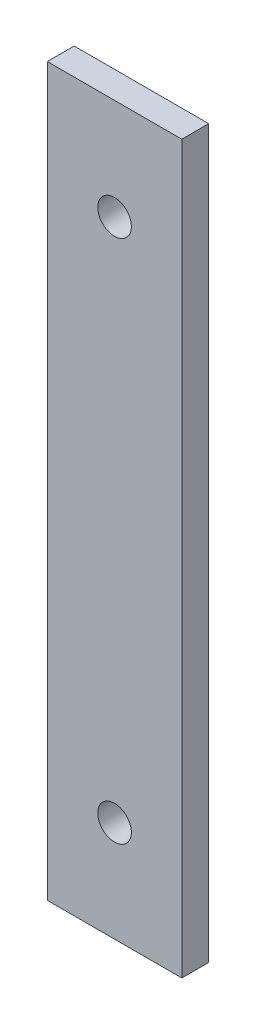
ISO-10303-21;
HEADER;
FILE_DESCRIPTION(('STEP AP214'),'2;1');
FILE_NAME('part.step','',(''),(''),'','','');
FILE_SCHEMA(('AUTOMOTIVE_DESIGN { 1 0 10303 214 1 1 1 1 }'));
ENDSEC;
DATA;
#1=APPLICATION_CONTEXT('core data for automotive mechanical design processes');
#2=APPLICATION_PROTOCOL_DEFINITION('international standard','automotive_design',2000,#1);
#3=PRODUCT_CONTEXT('',#1,'mechanical');
#4=PRODUCT('Part','Part','',(#3));
#5=PRODUCT_RELATED_PRODUCT_CATEGORY('part','',(#4));
#6=PRODUCT_DEFINITION_FORMATION('','',#4);
#7=PRODUCT_DEFINITION_CONTEXT('part definition',#1,'design');
#8=PRODUCT_DEFINITION('design','',#6,#7);
#9=PRODUCT_DEFINITION_SHAPE('','',#8);
#10=(LENGTH_UNIT() NAMED_UNIT(*) SI_UNIT(.MILLI.,.METRE.));
#11=(NAMED_UNIT(*) PLANE_ANGLE_UNIT() SI_UNIT($,.RADIAN.));
#12=(NAMED_UNIT(*) SI_UNIT($,.STERADIAN.) SOLID_ANGLE_UNIT());
#13=UNCERTAINTY_MEASURE_WITH_UNIT(LENGTH_MEASURE(1.E-05),#10,'distance_accuracy_value','');
#14=(GEOMETRIC_REPRESENTATION_CONTEXT(3) GLOBAL_UNCERTAINTY_ASSIGNED_CONTEXT((#13)) GLOBAL_UNIT_ASSIGNED_CONTEXT((#10,
#11,#12)) REPRESENTATION_CONTEXT('',''));
#15=CARTESIAN_POINT('',(0.,0.,0.));
#16=DIRECTION('',(0.,0.,1.));
#17=DIRECTION('',(1.,0.,0.));
#18=AXIS2_PLACEMENT_3D('',#15,#16,#17);
#19=CARTESIAN_POINT('',(0.,0.,2.));
#20=DIRECTION('',(0.,0.,1.));
#21=DIRECTION('',(1.,0.,0.));
#22=AXIS2_PLACEMENT_3D('',#19,#20,#21);
#23=PLANE('',#22);
#24=CARTESIAN_POINT('',(-1.72898253873052,6.36597938144332,2.));
#25=DIRECTION('',(0.,0.,1.));
#26=DIRECTION('',(1.,0.,0.));
#27=AXIS2_PLACEMENT_3D('',#24,#25,#26);
#28=CIRCLE('',#27,1.25);
#29=CARTESIAN_POINT('',(-0.478982538730516,6.36597938144332,2.));
#30=VERTEX_POINT('',#29);
#31=EDGE_CURVE('E100',#30,#30,#28,.T.);
#32=ORIENTED_EDGE('',*,*,#31,.F.);
#33=EDGE_LOOP('',(#32));
#34=FACE_BOUND('',#33,.T.);
#35=DIRECTION('',(0.,-1.,0.));
#36=VECTOR('',#35,1.);
#37=CARTESIAN_POINT('',(-6.72898253873052,13.8659793814433,2.));
#38=LINE('',#37,#36);
#39=CARTESIAN_POINT('',(-6.72898253873052,13.8659793814433,2.));
#40=VERTEX_POINT('',#39);
#41=CARTESIAN_POINT('',(-6.72898253873051,-40.1340206185567,2.));
#42=VERTEX_POINT('',#41);
#43=EDGE_CURVE('E85',#40,#42,#38,.T.);
#44=ORIENTED_EDGE('',*,*,#43,.T.);
#45=DIRECTION('',(1.,0.,0.));
#46=VECTOR('',#45,1.);
#47=CARTESIAN_POINT('',(-6.72898253873051,-40.1340206185567,2.));
#48=LINE('',#47,#46);
#49=CARTESIAN_POINT('',(3.27101746126949,-40.1340206185567,2.));
#50=VERTEX_POINT('',#49);
#51=EDGE_CURVE('E80',#42,#50,#48,.T.);
#52=ORIENTED_EDGE('',*,*,#51,.T.);
#53=DIRECTION('',(0.,1.,0.));
#54=VECTOR('',#53,1.);
#55=CARTESIAN_POINT('',(3.27101746126948,13.8659793814433,2.));
#56=LINE('',#55,#54);
#57=CARTESIAN_POINT('',(3.27101746126948,13.8659793814433,2.));
#58=VERTEX_POINT('',#57);
#59=EDGE_CURVE('E83',#50,#58,#56,.T.);
#60=ORIENTED_EDGE('',*,*,#59,.T.);
#61=DIRECTION('',(-1.,0.,0.));
#62=VECTOR('',#61,1.);
#63=CARTESIAN_POINT('',(-6.72898253873052,13.8659793814433,2.));
#64=LINE('',#63,#62);
#65=EDGE_CURVE('E50',#58,#40,#64,.T.);
#66=ORIENTED_EDGE('',*,*,#65,.T.);
#67=EDGE_LOOP('',(#44,#52,#60,#66));
#68=FACE_BOUND('',#67,.T.);
#69=CARTESIAN_POINT('',(-1.72898253873052,-32.6340206185567,2.));
#70=DIRECTION('',(0.,0.,1.));
#71=DIRECTION('',(1.,0.,0.));
#72=AXIS2_PLACEMENT_3D('',#69,#70,#71);
#73=CIRCLE('',#72,1.25);
#74=CARTESIAN_POINT('',(-0.478982538730515,-32.6340206185567,2.));
#75=VERTEX_POINT('',#74);
#76=EDGE_CURVE('E115',#75,#75,#73,.T.);
#77=ORIENTED_EDGE('',*,*,#76,.F.);
#78=EDGE_LOOP('',(#77));
#79=FACE_BOUND('',#78,.T.);
#80=ADVANCED_FACE('F33',(#34,#68,#79),#23,.T.);
#81=CARTESIAN_POINT('',(0.,0.,0.));
#82=DIRECTION('',(0.,0.,1.));
#83=DIRECTION('',(1.,0.,0.));
#84=AXIS2_PLACEMENT_3D('',#81,#82,#83);
#85=PLANE('',#84);
#86=DIRECTION('',(0.,-1.,0.));
#87=VECTOR('',#86,1.);
#88=CARTESIAN_POINT('',(-6.72898253873052,13.8659793814433,0.));
#89=LINE('',#88,#87);
#90=CARTESIAN_POINT('',(-6.72898253873052,13.8659793814433,0.));
#91=VERTEX_POINT('',#90);
#92=CARTESIAN_POINT('',(-6.72898253873051,-40.1340206185567,0.));
#93=VERTEX_POINT('',#92);
#94=EDGE_CURVE('E97',#91,#93,#89,.T.);
#95=ORIENTED_EDGE('',*,*,#94,.F.);
#96=DIRECTION('',(-1.,0.,0.));
#97=VECTOR('',#96,1.);
#98=CARTESIAN_POINT('',(-6.72898253873052,13.8659793814433,0.));
#99=LINE('',#98,#97);
#100=CARTESIAN_POINT('',(3.27101746126948,13.8659793814433,0.));
#101=VERTEX_POINT('',#100);
#102=EDGE_CURVE('E73',#101,#91,#99,.T.);
#103=ORIENTED_EDGE('',*,*,#102,.F.);
#104=DIRECTION('',(0.,1.,0.));
#105=VECTOR('',#104,1.);
#106=CARTESIAN_POINT('',(3.27101746126948,13.8659793814433,0.));
#107=LINE('',#106,#105);
#108=CARTESIAN_POINT('',(3.27101746126949,-40.1340206185567,0.));
#109=VERTEX_POINT('',#108);
#110=EDGE_CURVE('E67',#109,#101,#107,.T.);
#111=ORIENTED_EDGE('',*,*,#110,.F.);
#112=DIRECTION('',(1.,0.,0.));
#113=VECTOR('',#112,1.);
#114=CARTESIAN_POINT('',(-6.72898253873051,-40.1340206185567,0.));
#115=LINE('',#114,#113);
#116=EDGE_CURVE('E89',#93,#109,#115,.T.);
#117=ORIENTED_EDGE('',*,*,#116,.F.);
#118=EDGE_LOOP('',(#95,#103,#111,#117));
#119=FACE_BOUND('',#118,.T.);
#120=CARTESIAN_POINT('',(-1.72898253873052,6.36597938144332,0.));
#121=DIRECTION('',(0.,0.,1.));
#122=DIRECTION('',(1.,0.,0.));
#123=AXIS2_PLACEMENT_3D('',#120,#121,#122);
#124=CIRCLE('',#123,1.25);
#125=CARTESIAN_POINT('',(-0.478982538730516,6.36597938144332,0.));
#126=VERTEX_POINT('',#125);
#127=EDGE_CURVE('E112',#126,#126,#124,.T.);
#128=ORIENTED_EDGE('',*,*,#127,.T.);
#129=EDGE_LOOP('',(#128));
#130=FACE_BOUND('',#129,.T.);
#131=CARTESIAN_POINT('',(-1.72898253873052,-32.6340206185567,0.));
#132=DIRECTION('',(0.,0.,1.));
#133=DIRECTION('',(1.,0.,0.));
#134=AXIS2_PLACEMENT_3D('',#131,#132,#133);
#135=CIRCLE('',#134,1.25);
#136=CARTESIAN_POINT('',(-0.478982538730515,-32.6340206185567,0.));
#137=VERTEX_POINT('',#136);
#138=EDGE_CURVE('E118',#137,#137,#135,.T.);
#139=ORIENTED_EDGE('',*,*,#138,.T.);
#140=EDGE_LOOP('',(#139));
#141=FACE_BOUND('',#140,.T.);
#142=ADVANCED_FACE('F108',(#119,#130,#141),#85,.F.);
#143=CARTESIAN_POINT('',(-6.72898253873052,13.8659793814433,2.));
#144=DIRECTION('',(1.,0.,0.));
#145=DIRECTION('',(0.,1.,0.));
#146=AXIS2_PLACEMENT_3D('',#143,#144,#145);
#147=PLANE('',#146);
#148=ORIENTED_EDGE('',*,*,#94,.T.);
#149=DIRECTION('',(0.,0.,-1.));
#150=VECTOR('',#149,1.);
#151=CARTESIAN_POINT('',(-6.72898253873051,-40.1340206185567,2.));
#152=LINE('',#151,#150);
#153=EDGE_CURVE('E11',#42,#93,#152,.T.);
#154=ORIENTED_EDGE('',*,*,#153,.F.);
#155=ORIENTED_EDGE('',*,*,#43,.F.);
#156=DIRECTION('',(0.,0.,-1.));
#157=VECTOR('',#156,1.);
#158=CARTESIAN_POINT('',(-6.72898253873052,13.8659793814433,2.));
#159=LINE('',#158,#157);
#160=EDGE_CURVE('E93',#40,#91,#159,.T.);
#161=ORIENTED_EDGE('',*,*,#160,.T.);
#162=EDGE_LOOP('',(#148,#154,#155,#161));
#163=FACE_BOUND('',#162,.T.);
#164=ADVANCED_FACE('F35',(#163),#147,.F.);
#165=CARTESIAN_POINT('',(-6.72898253873051,-40.1340206185567,2.));
#166=DIRECTION('',(0.,1.,0.));
#167=DIRECTION('',(0.,0.,1.));
#168=AXIS2_PLACEMENT_3D('',#165,#166,#167);
#169=PLANE('',#168);
#170=ORIENTED_EDGE('',*,*,#116,.T.);
#171=DIRECTION('',(0.,0.,-1.));
#172=VECTOR('',#171,1.);
#173=CARTESIAN_POINT('',(3.27101746126949,-40.1340206185567,2.));
#174=LINE('',#173,#172);
#175=EDGE_CURVE('E42',#50,#109,#174,.T.);
#176=ORIENTED_EDGE('',*,*,#175,.F.);
#177=ORIENTED_EDGE('',*,*,#51,.F.);
#178=ORIENTED_EDGE('',*,*,#153,.T.);
#179=EDGE_LOOP('',(#170,#176,#177,#178));
#180=FACE_BOUND('',#179,.T.);
#181=ADVANCED_FACE('F88',(#180),#169,.F.);
#182=CARTESIAN_POINT('',(3.27101746126948,13.8659793814433,2.));
#183=DIRECTION('',(-1.,0.,0.));
#184=DIRECTION('',(0.,-1.,0.));
#185=AXIS2_PLACEMENT_3D('',#182,#183,#184);
#186=PLANE('',#185);
#187=ORIENTED_EDGE('',*,*,#110,.T.);
#188=DIRECTION('',(0.,0.,-1.));
#189=VECTOR('',#188,1.);
#190=CARTESIAN_POINT('',(3.27101746126948,13.8659793814433,2.));
#191=LINE('',#190,#189);
#192=EDGE_CURVE('E90',#58,#101,#191,.T.);
#193=ORIENTED_EDGE('',*,*,#192,.F.);
#194=ORIENTED_EDGE('',*,*,#59,.F.);
#195=ORIENTED_EDGE('',*,*,#175,.T.);
#196=EDGE_LOOP('',(#187,#193,#194,#195));
#197=FACE_BOUND('',#196,.T.);
#198=ADVANCED_FACE('F91',(#197),#186,.F.);
#199=CARTESIAN_POINT('',(-6.72898253873052,13.8659793814433,2.));
#200=DIRECTION('',(0.,-1.,0.));
#201=DIRECTION('',(0.,0.,-1.));
#202=AXIS2_PLACEMENT_3D('',#199,#200,#201);
#203=PLANE('',#202);
#204=ORIENTED_EDGE('',*,*,#102,.T.);
#205=ORIENTED_EDGE('',*,*,#160,.F.);
#206=ORIENTED_EDGE('',*,*,#65,.F.);
#207=ORIENTED_EDGE('',*,*,#192,.T.);
#208=EDGE_LOOP('',(#204,#205,#206,#207));
#209=FACE_BOUND('',#208,.T.);
#210=ADVANCED_FACE('F105',(#209),#203,.F.);
#211=CARTESIAN_POINT('',(-1.72898253873052,6.36597938144332,2.));
#212=DIRECTION('',(0.,0.,-1.));
#213=DIRECTION('',(-1.,0.,0.));
#214=AXIS2_PLACEMENT_3D('',#211,#212,#213);
#215=CYLINDRICAL_SURFACE('',#214,1.25);
#216=ORIENTED_EDGE('',*,*,#31,.T.);
#217=EDGE_LOOP('',(#216));
#218=FACE_BOUND('',#217,.T.);
#219=ORIENTED_EDGE('',*,*,#127,.F.);
#220=EDGE_LOOP('',(#219));
#221=FACE_BOUND('',#220,.T.);
#222=ADVANCED_FACE('F135',(#218,#221),#215,.F.);
#223=CARTESIAN_POINT('',(-1.72898253873052,-32.6340206185567,2.));
#224=DIRECTION('',(0.,0.,-1.));
#225=DIRECTION('',(-1.,0.,0.));
#226=AXIS2_PLACEMENT_3D('',#223,#224,#225);
#227=CYLINDRICAL_SURFACE('',#226,1.25);
#228=ORIENTED_EDGE('',*,*,#76,.T.);
#229=EDGE_LOOP('',(#228));
#230=FACE_BOUND('',#229,.T.);
#231=ORIENTED_EDGE('',*,*,#138,.F.);
#232=EDGE_LOOP('',(#231));
#233=FACE_BOUND('',#232,.T.);
#234=ADVANCED_FACE('F124',(#230,#233),#227,.F.);
#235=CLOSED_SHELL('',(#80,#142,#164,#181,#198,#210,#222,#234));
#236=MANIFOLD_SOLID_BREP('B2',#235);
#237=ADVANCED_BREP_SHAPE_REPRESENTATION('',(#18,#236),#14);
#238=SHAPE_DEFINITION_REPRESENTATION(#9,#237);
ENDSEC;
END-ISO-10303-21;
